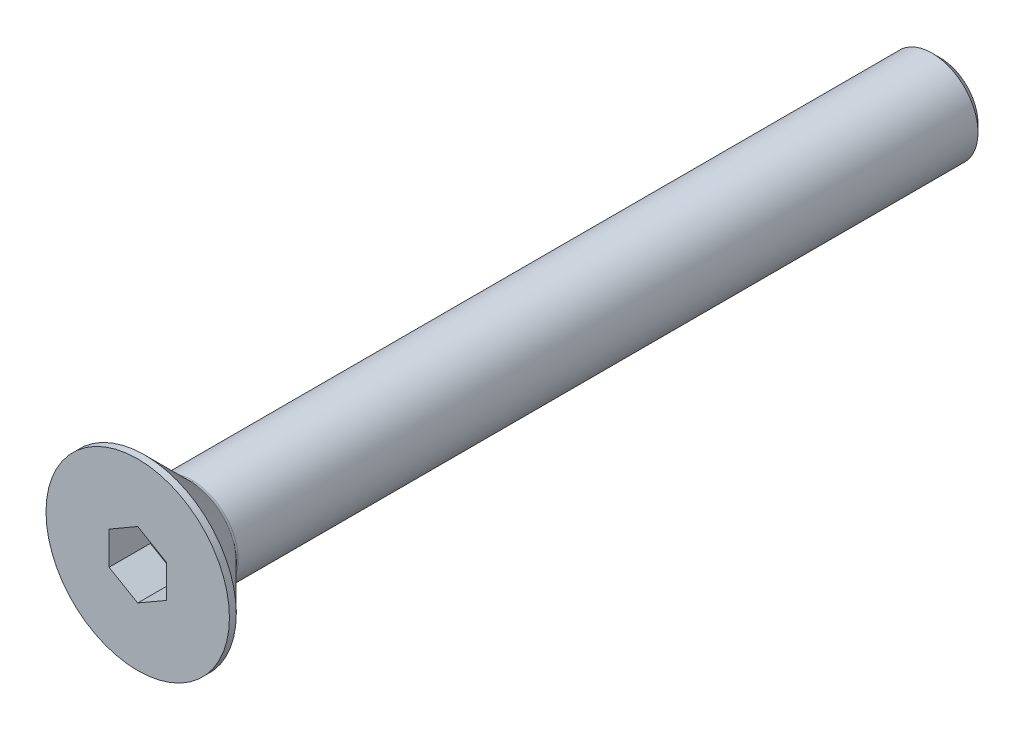
ISO-10303-21;
HEADER;
FILE_DESCRIPTION(('STEP AP214'),'2;1');
FILE_NAME('part.step','',(''),(''),'','','');
FILE_SCHEMA(('AUTOMOTIVE_DESIGN { 1 0 10303 214 1 1 1 1 }'));
ENDSEC;
DATA;
#1=APPLICATION_CONTEXT('core data for automotive mechanical design processes');
#2=APPLICATION_PROTOCOL_DEFINITION('international standard','automotive_design',2000,#1);
#3=PRODUCT_CONTEXT('',#1,'mechanical');
#4=PRODUCT('Part','Part','',(#3));
#5=PRODUCT_RELATED_PRODUCT_CATEGORY('part','',(#4));
#6=PRODUCT_DEFINITION_FORMATION('','',#4);
#7=PRODUCT_DEFINITION_CONTEXT('part definition',#1,'design');
#8=PRODUCT_DEFINITION('design','',#6,#7);
#9=PRODUCT_DEFINITION_SHAPE('','',#8);
#10=(LENGTH_UNIT() NAMED_UNIT(*) SI_UNIT(.MILLI.,.METRE.));
#11=(NAMED_UNIT(*) PLANE_ANGLE_UNIT() SI_UNIT($,.RADIAN.));
#12=(NAMED_UNIT(*) SI_UNIT($,.STERADIAN.) SOLID_ANGLE_UNIT());
#13=UNCERTAINTY_MEASURE_WITH_UNIT(LENGTH_MEASURE(1.E-05),#10,'distance_accuracy_value','');
#14=(GEOMETRIC_REPRESENTATION_CONTEXT(3) GLOBAL_UNCERTAINTY_ASSIGNED_CONTEXT((#13)) GLOBAL_UNIT_ASSIGNED_CONTEXT((#10,
#11,#12)) REPRESENTATION_CONTEXT('',''));
#15=CARTESIAN_POINT('',(0.,0.,0.));
#16=DIRECTION('',(0.,0.,1.));
#17=DIRECTION('',(1.,0.,0.));
#18=AXIS2_PLACEMENT_3D('',#15,#16,#17);
#19=CARTESIAN_POINT('',(0.,1.44337567297406,0.));
#20=DIRECTION('',(-0.5,0.866025403784439,0.));
#21=DIRECTION('',(-0.866025403784439,-0.5,0.));
#22=AXIS2_PLACEMENT_3D('',#19,#20,#21);
#23=PLANE('',#22);
#24=DIRECTION('',(0.,0.,1.));
#25=VECTOR('',#24,1.);
#26=CARTESIAN_POINT('',(0.,1.44337567297406,0.));
#27=LINE('',#26,#25);
#28=CARTESIAN_POINT('',(0.,1.44337567297406,-1.8));
#29=VERTEX_POINT('',#28);
#30=CARTESIAN_POINT('',(0.,1.44337567297406,0.));
#31=VERTEX_POINT('',#30);
#32=EDGE_CURVE('E82',#29,#31,#27,.T.);
#33=ORIENTED_EDGE('',*,*,#32,.T.);
#34=DIRECTION('',(-0.866025403784439,-0.5,0.));
#35=VECTOR('',#34,1.);
#36=CARTESIAN_POINT('',(0.,1.44337567297406,0.));
#37=LINE('',#36,#35);
#38=CARTESIAN_POINT('',(-1.25,0.721687836487032,0.));
#39=VERTEX_POINT('',#38);
#40=EDGE_CURVE('E71',#39,#31,#37,.F.);
#41=ORIENTED_EDGE('',*,*,#40,.F.);
#42=DIRECTION('',(0.,0.,1.));
#43=VECTOR('',#42,1.);
#44=CARTESIAN_POINT('',(-1.25,0.721687836487033,0.));
#45=LINE('',#44,#43);
#46=CARTESIAN_POINT('',(-1.25,0.721687836487031,-1.8));
#47=VERTEX_POINT('',#46);
#48=EDGE_CURVE('E134',#39,#47,#45,.F.);
#49=ORIENTED_EDGE('',*,*,#48,.T.);
#50=DIRECTION('',(-0.866025403784439,-0.5,0.));
#51=VECTOR('',#50,1.);
#52=CARTESIAN_POINT('',(0.,1.44337567297406,-1.8));
#53=LINE('',#52,#51);
#54=EDGE_CURVE('E67',#29,#47,#53,.T.);
#55=ORIENTED_EDGE('',*,*,#54,.F.);
#56=EDGE_LOOP('',(#33,#41,#49,#55));
#57=FACE_BOUND('',#56,.T.);
#58=ADVANCED_FACE('F17',(#57),#23,.F.);
#59=CARTESIAN_POINT('',(1.25,0.721687836487033,0.));
#60=DIRECTION('',(0.499999999999999,0.866025403784439,0.));
#61=DIRECTION('',(-0.866025403784439,0.499999999999999,0.));
#62=AXIS2_PLACEMENT_3D('',#59,#60,#61);
#63=PLANE('',#62);
#64=DIRECTION('',(0.,0.,-1.));
#65=VECTOR('',#64,1.);
#66=CARTESIAN_POINT('',(1.25,0.721687836487033,0.));
#67=LINE('',#66,#65);
#68=CARTESIAN_POINT('',(1.25,0.721687836487033,-1.8));
#69=VERTEX_POINT('',#68);
#70=CARTESIAN_POINT('',(1.25,0.721687836487033,0.));
#71=VERTEX_POINT('',#70);
#72=EDGE_CURVE('E87',#69,#71,#67,.F.);
#73=ORIENTED_EDGE('',*,*,#72,.T.);
#74=DIRECTION('',(-0.866025403784439,0.499999999999999,0.));
#75=VECTOR('',#74,1.);
#76=CARTESIAN_POINT('',(1.25,0.721687836487033,0.));
#77=LINE('',#76,#75);
#78=EDGE_CURVE('E75',#31,#71,#77,.F.);
#79=ORIENTED_EDGE('',*,*,#78,.F.);
#80=ORIENTED_EDGE('',*,*,#32,.F.);
#81=DIRECTION('',(-0.866025403784439,0.499999999999999,0.));
#82=VECTOR('',#81,1.);
#83=CARTESIAN_POINT('',(1.25,0.721687836487033,-1.8));
#84=LINE('',#83,#82);
#85=EDGE_CURVE('E88',#69,#29,#84,.T.);
#86=ORIENTED_EDGE('',*,*,#85,.F.);
#87=EDGE_LOOP('',(#73,#79,#80,#86));
#88=FACE_BOUND('',#87,.T.);
#89=ADVANCED_FACE('F85',(#88),#63,.F.);
#90=CARTESIAN_POINT('',(-1.25,0.721687836487033,0.));
#91=DIRECTION('',(-1.,0.,0.));
#92=DIRECTION('',(0.,0.,1.));
#93=AXIS2_PLACEMENT_3D('',#90,#91,#92);
#94=PLANE('',#93);
#95=ORIENTED_EDGE('',*,*,#48,.F.);
#96=DIRECTION('',(0.,1.,0.));
#97=VECTOR('',#96,1.);
#98=CARTESIAN_POINT('',(-1.25,0.721687836487033,0.));
#99=LINE('',#98,#97);
#100=CARTESIAN_POINT('',(-1.25,-0.721687836487033,0.));
#101=VERTEX_POINT('',#100);
#102=EDGE_CURVE('E78',#101,#39,#99,.T.);
#103=ORIENTED_EDGE('',*,*,#102,.F.);
#104=DIRECTION('',(0.,0.,1.));
#105=VECTOR('',#104,1.);
#106=CARTESIAN_POINT('',(-1.25,-0.721687836487033,0.));
#107=LINE('',#106,#105);
#108=CARTESIAN_POINT('',(-1.25,-0.721687836487033,-1.8));
#109=VERTEX_POINT('',#108);
#110=EDGE_CURVE('E125',#101,#109,#107,.F.);
#111=ORIENTED_EDGE('',*,*,#110,.T.);
#112=DIRECTION('',(0.,1.,0.));
#113=VECTOR('',#112,1.);
#114=CARTESIAN_POINT('',(-1.25,0.721687836487033,-1.8));
#115=LINE('',#114,#113);
#116=EDGE_CURVE('E132',#47,#109,#115,.F.);
#117=ORIENTED_EDGE('',*,*,#116,.F.);
#118=EDGE_LOOP('',(#95,#103,#111,#117));
#119=FACE_BOUND('',#118,.T.);
#120=ADVANCED_FACE('F137',(#119),#94,.F.);
#121=CARTESIAN_POINT('',(1.25,-0.721687836487032,0.));
#122=DIRECTION('',(1.,0.,0.));
#123=DIRECTION('',(0.,0.,-1.));
#124=AXIS2_PLACEMENT_3D('',#121,#122,#123);
#125=PLANE('',#124);
#126=DIRECTION('',(0.,0.,1.));
#127=VECTOR('',#126,1.);
#128=CARTESIAN_POINT('',(1.25,-0.721687836487029,0.));
#129=LINE('',#128,#127);
#130=CARTESIAN_POINT('',(1.25,-0.721687836487031,-1.8));
#131=VERTEX_POINT('',#130);
#132=CARTESIAN_POINT('',(1.25,-0.721687836487031,0.));
#133=VERTEX_POINT('',#132);
#134=EDGE_CURVE('E117',#131,#133,#129,.T.);
#135=ORIENTED_EDGE('',*,*,#134,.T.);
#136=DIRECTION('',(0.,1.,0.));
#137=VECTOR('',#136,1.);
#138=CARTESIAN_POINT('',(1.25,-0.721687836487032,0.));
#139=LINE('',#138,#137);
#140=EDGE_CURVE('E35',#71,#133,#139,.F.);
#141=ORIENTED_EDGE('',*,*,#140,.F.);
#142=ORIENTED_EDGE('',*,*,#72,.F.);
#143=DIRECTION('',(0.,1.,0.));
#144=VECTOR('',#143,1.);
#145=CARTESIAN_POINT('',(1.25,0.,-1.8));
#146=LINE('',#145,#144);
#147=EDGE_CURVE('E119',#131,#69,#146,.T.);
#148=ORIENTED_EDGE('',*,*,#147,.F.);
#149=EDGE_LOOP('',(#135,#141,#142,#148));
#150=FACE_BOUND('',#149,.T.);
#151=ADVANCED_FACE('F144',(#150),#125,.F.);
#152=CARTESIAN_POINT('',(-1.25,-0.721687836487033,0.));
#153=DIRECTION('',(-0.499999999999999,-0.866025403784439,0.));
#154=DIRECTION('',(0.866025403784439,-0.499999999999999,0.));
#155=AXIS2_PLACEMENT_3D('',#152,#153,#154);
#156=PLANE('',#155);
#157=ORIENTED_EDGE('',*,*,#110,.F.);
#158=DIRECTION('',(0.866025403784439,-0.499999999999999,0.));
#159=VECTOR('',#158,1.);
#160=CARTESIAN_POINT('',(-1.25,-0.721687836487033,0.));
#161=LINE('',#160,#159);
#162=CARTESIAN_POINT('',(0.,-1.44337567297406,0.));
#163=VERTEX_POINT('',#162);
#164=EDGE_CURVE('E128',#163,#101,#161,.F.);
#165=ORIENTED_EDGE('',*,*,#164,.F.);
#166=DIRECTION('',(0.,0.,1.));
#167=VECTOR('',#166,1.);
#168=CARTESIAN_POINT('',(0.,-1.44337567297406,0.));
#169=LINE('',#168,#167);
#170=CARTESIAN_POINT('',(0.,-1.44337567297406,-1.8));
#171=VERTEX_POINT('',#170);
#172=EDGE_CURVE('E111',#163,#171,#169,.F.);
#173=ORIENTED_EDGE('',*,*,#172,.T.);
#174=DIRECTION('',(0.86602540378444,-0.499999999999997,0.));
#175=VECTOR('',#174,1.);
#176=CARTESIAN_POINT('',(-1.25,-0.721687836487033,-1.8));
#177=LINE('',#176,#175);
#178=EDGE_CURVE('E122',#109,#171,#177,.T.);
#179=ORIENTED_EDGE('',*,*,#178,.F.);
#180=EDGE_LOOP('',(#157,#165,#173,#179));
#181=FACE_BOUND('',#180,.T.);
#182=ADVANCED_FACE('F150',(#181),#156,.F.);
#183=CARTESIAN_POINT('',(0.,0.,-1.8));
#184=DIRECTION('',(0.,0.,1.));
#185=DIRECTION('',(1.,0.,0.));
#186=AXIS2_PLACEMENT_3D('',#183,#184,#185);
#187=PLANE('',#186);
#188=ORIENTED_EDGE('',*,*,#54,.T.);
#189=ORIENTED_EDGE('',*,*,#116,.T.);
#190=ORIENTED_EDGE('',*,*,#178,.T.);
#191=DIRECTION('',(0.866025403784439,0.5,0.));
#192=VECTOR('',#191,1.);
#193=CARTESIAN_POINT('',(0.,-1.44337567297406,-1.8));
#194=LINE('',#193,#192);
#195=EDGE_CURVE('E107',#171,#131,#194,.T.);
#196=ORIENTED_EDGE('',*,*,#195,.T.);
#197=ORIENTED_EDGE('',*,*,#147,.T.);
#198=ORIENTED_EDGE('',*,*,#85,.T.);
#199=EDGE_LOOP('',(#188,#189,#190,#196,#197,#198));
#200=FACE_BOUND('',#199,.T.);
#201=ADVANCED_FACE('F141',(#200),#187,.T.);
#202=CARTESIAN_POINT('',(0.,-1.44337567297406,0.));
#203=DIRECTION('',(0.5,-0.866025403784439,0.));
#204=DIRECTION('',(0.866025403784439,0.5,0.));
#205=AXIS2_PLACEMENT_3D('',#202,#203,#204);
#206=PLANE('',#205);
#207=ORIENTED_EDGE('',*,*,#172,.F.);
#208=DIRECTION('',(-0.86602540378444,-0.499999999999998,0.));
#209=VECTOR('',#208,1.);
#210=CARTESIAN_POINT('',(1.25,-0.721687836487032,0.));
#211=LINE('',#210,#209);
#212=EDGE_CURVE('E102',#133,#163,#211,.T.);
#213=ORIENTED_EDGE('',*,*,#212,.F.);
#214=ORIENTED_EDGE('',*,*,#134,.F.);
#215=ORIENTED_EDGE('',*,*,#195,.F.);
#216=EDGE_LOOP('',(#207,#213,#214,#215));
#217=FACE_BOUND('',#216,.T.);
#218=ADVANCED_FACE('F148',(#217),#206,.F.);
#219=CARTESIAN_POINT('',(2.,0.,0.));
#220=DIRECTION('',(0.,0.,1.));
#221=DIRECTION('',(1.,0.,0.));
#222=AXIS2_PLACEMENT_3D('',#219,#220,#221);
#223=PLANE('',#222);
#224=ORIENTED_EDGE('',*,*,#140,.T.);
#225=ORIENTED_EDGE('',*,*,#212,.T.);
#226=ORIENTED_EDGE('',*,*,#164,.T.);
#227=ORIENTED_EDGE('',*,*,#102,.T.);
#228=ORIENTED_EDGE('',*,*,#40,.T.);
#229=ORIENTED_EDGE('',*,*,#78,.T.);
#230=EDGE_LOOP('',(#224,#225,#226,#227,#228,#229));
#231=FACE_BOUND('',#230,.T.);
#232=CARTESIAN_POINT('',(0.,0.,0.));
#233=DIRECTION('',(0.,0.,-1.));
#234=DIRECTION('',(-1.,0.,0.));
#235=AXIS2_PLACEMENT_3D('',#232,#233,#234);
#236=CIRCLE('',#235,4.);
#237=CARTESIAN_POINT('',(-4.,0.,0.));
#238=VERTEX_POINT('',#237);
#239=EDGE_CURVE('E99',#238,#238,#236,.T.);
#240=ORIENTED_EDGE('',*,*,#239,.F.);
#241=EDGE_LOOP('',(#240));
#242=FACE_BOUND('',#241,.T.);
#243=ADVANCED_FACE('F72',(#231,#242),#223,.T.);
#244=CARTESIAN_POINT('',(0.,0.,-0.150000000000001));
#245=DIRECTION('',(0.,0.,-1.));
#246=DIRECTION('',(-1.,0.,0.));
#247=AXIS2_PLACEMENT_3D('',#244,#245,#246);
#248=CYLINDRICAL_SURFACE('',#247,4.);
#249=ORIENTED_EDGE('',*,*,#239,.T.);
#250=EDGE_LOOP('',(#249));
#251=FACE_BOUND('',#250,.T.);
#252=CARTESIAN_POINT('',(0.,0.,-0.299999999981537));
#253=DIRECTION('',(0.,0.,1.));
#254=DIRECTION('',(1.,0.,0.));
#255=AXIS2_PLACEMENT_3D('',#252,#253,#254);
#256=CIRCLE('',#255,3.99999999996226);
#257=CARTESIAN_POINT('',(3.99999999996226,0.,-0.299999999981537));
#258=VERTEX_POINT('',#257);
#259=EDGE_CURVE('E101',#258,#258,#256,.F.);
#260=ORIENTED_EDGE('',*,*,#259,.F.);
#261=EDGE_LOOP('',(#260));
#262=FACE_BOUND('',#261,.T.);
#263=ADVANCED_FACE('F193',(#251,#262),#248,.T.);
#264=CARTESIAN_POINT('',(0.,0.,-0.299999999981537));
#265=DIRECTION('',(0.,0.,1.));
#266=DIRECTION('',(1.,0.,0.));
#267=AXIS2_PLACEMENT_3D('',#264,#265,#266);
#268=CONICAL_SURFACE('',#267,3.99999999996226,0.785398163397448);
#269=CARTESIAN_POINT('',(0.,0.,-2.24142135623731));
#270=DIRECTION('',(0.,0.,-1.));
#271=DIRECTION('',(-1.,0.,0.));
#272=AXIS2_PLACEMENT_3D('',#269,#270,#271);
#273=CIRCLE('',#272,2.05857864376269);
#274=CARTESIAN_POINT('',(-2.05857864376269,0.,-2.24142135623731));
#275=VERTEX_POINT('',#274);
#276=EDGE_CURVE('E97',#275,#275,#273,.F.);
#277=ORIENTED_EDGE('',*,*,#276,.T.);
#278=EDGE_LOOP('',(#277));
#279=FACE_BOUND('',#278,.T.);
#280=ORIENTED_EDGE('',*,*,#259,.T.);
#281=EDGE_LOOP('',(#280));
#282=FACE_BOUND('',#281,.T.);
#283=ADVANCED_FACE('F189',(#279,#282),#268,.T.);
#284=CARTESIAN_POINT('',(0.999999999999998,0.,-35.));
#285=DIRECTION('',(0.,0.,-1.));
#286=DIRECTION('',(-1.,0.,0.));
#287=AXIS2_PLACEMENT_3D('',#284,#285,#286);
#288=PLANE('',#287);
#289=CARTESIAN_POINT('',(0.,0.,-35.000000000025));
#290=DIRECTION('',(0.,0.,1.));
#291=DIRECTION('',(1.,0.,0.));
#292=AXIS2_PLACEMENT_3D('',#289,#290,#291);
#293=CIRCLE('',#292,1.64999999998372);
#294=CARTESIAN_POINT('',(1.64999999998372,0.,-35.000000000025));
#295=VERTEX_POINT('',#294);
#296=EDGE_CURVE('E94',#295,#295,#293,.T.);
#297=ORIENTED_EDGE('',*,*,#296,.F.);
#298=EDGE_LOOP('',(#297));
#299=FACE_BOUND('',#298,.T.);
#300=ADVANCED_FACE('F176',(#299),#288,.T.);
#301=CARTESIAN_POINT('',(0.,0.,-2.38284271247462));
#302=DIRECTION('',(0.,0.,-1.));
#303=DIRECTION('',(-1.,0.,0.));
#304=AXIS2_PLACEMENT_3D('',#301,#302,#303);
#305=TOROIDAL_SURFACE('',#304,2.2,0.2);
#306=CARTESIAN_POINT('',(0.,0.,-2.38284271247462));
#307=DIRECTION('',(0.,0.,-1.));
#308=DIRECTION('',(-1.,0.,0.));
#309=AXIS2_PLACEMENT_3D('',#306,#307,#308);
#310=CIRCLE('',#309,2.);
#311=CARTESIAN_POINT('',(-2.,0.,-2.38284271247462));
#312=VERTEX_POINT('',#311);
#313=EDGE_CURVE('E26',#312,#312,#310,.T.);
#314=ORIENTED_EDGE('',*,*,#313,.F.);
#315=EDGE_LOOP('',(#314));
#316=FACE_BOUND('',#315,.T.);
#317=ORIENTED_EDGE('',*,*,#276,.F.);
#318=EDGE_LOOP('',(#317));
#319=FACE_BOUND('',#318,.T.);
#320=ADVANCED_FACE('F168',(#316,#319),#305,.F.);
#321=CARTESIAN_POINT('',(0.,0.,-34.6499999999992));
#322=DIRECTION('',(0.,0.,1.));
#323=DIRECTION('',(1.,0.,0.));
#324=AXIS2_PLACEMENT_3D('',#321,#322,#323);
#325=CONICAL_SURFACE('',#324,2.00000000000955,0.785398163397448);
#326=ORIENTED_EDGE('',*,*,#296,.T.);
#327=EDGE_LOOP('',(#326));
#328=FACE_BOUND('',#327,.T.);
#329=CARTESIAN_POINT('',(0.,0.,-34.65));
#330=DIRECTION('',(0.,0.,-1.));
#331=DIRECTION('',(-1.,0.,0.));
#332=AXIS2_PLACEMENT_3D('',#329,#330,#331);
#333=CIRCLE('',#332,2.);
#334=CARTESIAN_POINT('',(-2.,0.,-34.65));
#335=VERTEX_POINT('',#334);
#336=EDGE_CURVE('E11',#335,#335,#333,.F.);
#337=ORIENTED_EDGE('',*,*,#336,.F.);
#338=EDGE_LOOP('',(#337));
#339=FACE_BOUND('',#338,.T.);
#340=ADVANCED_FACE('F162',(#328,#339),#325,.T.);
#341=CARTESIAN_POINT('',(0.,0.,-18.65));
#342=DIRECTION('',(0.,0.,-1.));
#343=DIRECTION('',(-1.,0.,0.));
#344=AXIS2_PLACEMENT_3D('',#341,#342,#343);
#345=CYLINDRICAL_SURFACE('',#344,2.);
#346=ORIENTED_EDGE('',*,*,#336,.T.);
#347=EDGE_LOOP('',(#346));
#348=FACE_BOUND('',#347,.T.);
#349=ORIENTED_EDGE('',*,*,#313,.T.);
#350=EDGE_LOOP('',(#349));
#351=FACE_BOUND('',#350,.T.);
#352=ADVANCED_FACE('F160',(#348,#351),#345,.T.);
#353=CLOSED_SHELL('',(#58,#89,#120,#151,#182,#201,#218,#243,#263,#283,#300,#320,#340,#352));
#354=MANIFOLD_SOLID_BREP('B1',#353);
#355=ADVANCED_BREP_SHAPE_REPRESENTATION('',(#18,#354),#14);
#356=SHAPE_DEFINITION_REPRESENTATION(#9,#355);
ENDSEC;
END-ISO-10303-21;
